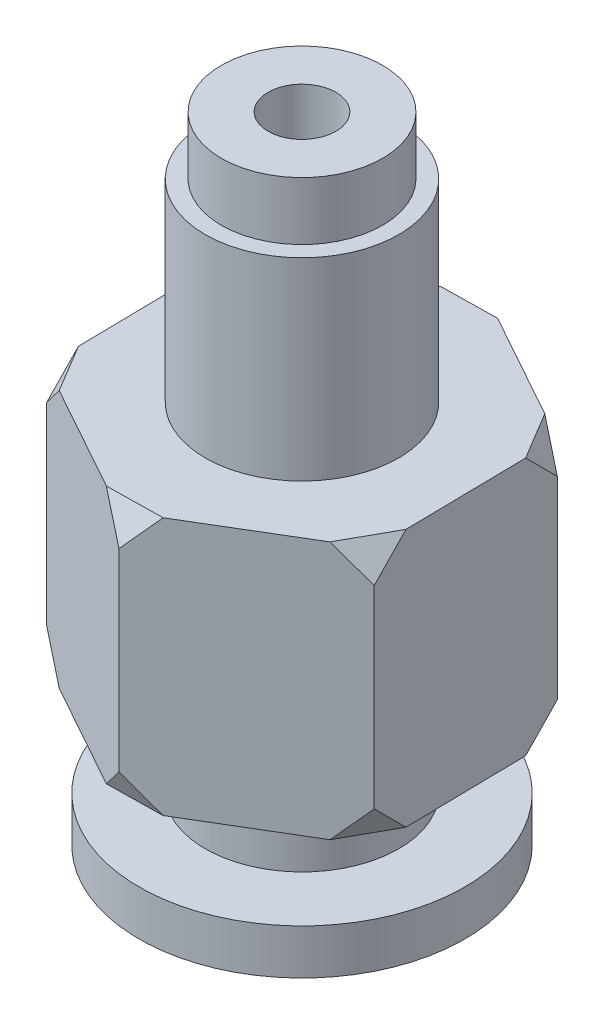
ISO-10303-21;
HEADER;
FILE_DESCRIPTION(('STEP AP214'),'2;1');
FILE_NAME('part.step','',(''),(''),'','','');
FILE_SCHEMA(('AUTOMOTIVE_DESIGN { 1 0 10303 214 1 1 1 1 }'));
ENDSEC;
DATA;
#1=APPLICATION_CONTEXT('core data for automotive mechanical design processes');
#2=APPLICATION_PROTOCOL_DEFINITION('international standard','automotive_design',2000,#1);
#3=PRODUCT_CONTEXT('',#1,'mechanical');
#4=PRODUCT('Part','Part','',(#3));
#5=PRODUCT_RELATED_PRODUCT_CATEGORY('part','',(#4));
#6=PRODUCT_DEFINITION_FORMATION('','',#4);
#7=PRODUCT_DEFINITION_CONTEXT('part definition',#1,'design');
#8=PRODUCT_DEFINITION('design','',#6,#7);
#9=PRODUCT_DEFINITION_SHAPE('','',#8);
#10=(LENGTH_UNIT() NAMED_UNIT(*) SI_UNIT(.MILLI.,.METRE.));
#11=(NAMED_UNIT(*) PLANE_ANGLE_UNIT() SI_UNIT($,.RADIAN.));
#12=(NAMED_UNIT(*) SI_UNIT($,.STERADIAN.) SOLID_ANGLE_UNIT());
#13=UNCERTAINTY_MEASURE_WITH_UNIT(LENGTH_MEASURE(1.E-05),#10,'distance_accuracy_value','');
#14=(GEOMETRIC_REPRESENTATION_CONTEXT(3) GLOBAL_UNCERTAINTY_ASSIGNED_CONTEXT((#13)) GLOBAL_UNIT_ASSIGNED_CONTEXT((#10,
#11,#12)) REPRESENTATION_CONTEXT('',''));
#15=CARTESIAN_POINT('',(0.,0.,0.));
#16=DIRECTION('',(0.,0.,1.));
#17=DIRECTION('',(1.,0.,0.));
#18=AXIS2_PLACEMENT_3D('',#15,#16,#17);
#19=CARTESIAN_POINT('',(0.,8.,0.));
#20=DIRECTION('',(0.,1.,0.));
#21=DIRECTION('',(0.,0.,1.));
#22=AXIS2_PLACEMENT_3D('',#19,#20,#21);
#23=PLANE('',#22);
#24=CARTESIAN_POINT('',(0.,8.,0.));
#25=DIRECTION('',(0.,1.,0.));
#26=DIRECTION('',(0.,0.,1.));
#27=AXIS2_PLACEMENT_3D('',#24,#25,#26);
#28=CIRCLE('',#27,3.);
#29=CARTESIAN_POINT('',(0.,8.,3.));
#30=VERTEX_POINT('',#29);
#31=EDGE_CURVE('E311',#30,#30,#28,.T.);
#32=ORIENTED_EDGE('',*,*,#31,.F.);
#33=EDGE_LOOP('',(#32));
#34=FACE_BOUND('',#33,.T.);
#35=DIRECTION('',(0.874029367472447,0.,0.485873095361036));
#36=VECTOR('',#35,1.);
#37=CARTESIAN_POINT('',(-4.95247092975446,8.,2.96755202536878));
#38=LINE('',#37,#36);
#39=CARTESIAN_POINT('',(-4.07844156228201,8.,3.45342512072982));
#40=VERTEX_POINT('',#39);
#41=CARTESIAN_POINT('',(-0.780289391328353,8.,5.28686855399465));
#42=VERTEX_POINT('',#41);
#43=EDGE_CURVE('E172',#40,#42,#38,.T.);
#44=ORIENTED_EDGE('',*,*,#43,.T.);
#45=DIRECTION('',(0.999868183565301,0.,-0.0162362401381879));
#46=VECTOR('',#45,1.);
#47=CARTESIAN_POINT('',(0.085621856075008,8.,5.27280755757304));
#48=LINE('',#47,#46);
#49=CARTESIAN_POINT('',(0.951533103478362,8.,5.25874656115142));
#50=VERTEX_POINT('',#49);
#51=EDGE_CURVE('E175',#42,#50,#48,.T.);
#52=ORIENTED_EDGE('',*,*,#51,.T.);
#53=DIRECTION('',(0.85779312733426,0.,-0.513995088204266));
#54=VECTOR('',#53,1.);
#55=CARTESIAN_POINT('',(0.0937399761440992,8.,5.77274164935569));
#56=LINE('',#55,#54);
#57=CARTESIAN_POINT('',(4.18841777856429,8.,3.31918471219117));
#58=VERTEX_POINT('',#57);
#59=EDGE_CURVE('E161',#50,#58,#56,.T.);
#60=ORIENTED_EDGE('',*,*,#59,.T.);
#61=DIRECTION('',(0.485873095361036,0.,-0.874029367472447));
#62=VECTOR('',#61,1.);
#63=CARTESIAN_POINT('',(4.60919622216233,8.,2.56225307630639));
#64=LINE('',#63,#62);
#65=CARTESIAN_POINT('',(5.02997466576037,8.,1.8053214404216));
#66=VERTEX_POINT('',#65);
#67=EDGE_CURVE('E189',#58,#66,#64,.T.);
#68=ORIENTED_EDGE('',*,*,#67,.T.);
#69=DIRECTION('',(-0.0162362401381876,0.,-0.999868183565301));
#70=VECTOR('',#69,1.);
#71=CARTESIAN_POINT('',(5.04621090589856,8.,2.80518962398691));
#72=LINE('',#71,#70);
#73=CARTESIAN_POINT('',(4.96870716989264,8.,-1.96768384180347));
#74=VERTEX_POINT('',#73);
#75=EDGE_CURVE('E329',#66,#74,#72,.T.);
#76=ORIENTED_EDGE('',*,*,#75,.T.);
#77=DIRECTION('',(0.513995088204266,0.,0.857793127334259));
#78=VECTOR('',#77,1.);
#79=CARTESIAN_POINT('',(4.52357436608732,8.,-2.71055448126665));
#80=LINE('',#79,#78);
#81=CARTESIAN_POINT('',(4.078441562282,8.,-3.45342512072982));
#82=VERTEX_POINT('',#81);
#83=EDGE_CURVE('E269',#82,#74,#80,.T.);
#84=ORIENTED_EDGE('',*,*,#83,.F.);
#85=DIRECTION('',(-0.874029367472447,0.,-0.485873095361036));
#86=VECTOR('',#85,1.);
#87=CARTESIAN_POINT('',(4.95247092975446,8.,-2.96755202536878));
#88=LINE('',#87,#86);
#89=CARTESIAN_POINT('',(0.78028939132835,8.,-5.28686855399465));
#90=VERTEX_POINT('',#89);
#91=EDGE_CURVE('E357',#82,#90,#88,.T.);
#92=ORIENTED_EDGE('',*,*,#91,.T.);
#93=DIRECTION('',(-0.999868183565301,0.,0.0162362401381879));
#94=VECTOR('',#93,1.);
#95=CARTESIAN_POINT('',(-0.085621856075008,8.,-5.27280755757304));
#96=LINE('',#95,#94);
#97=CARTESIAN_POINT('',(-0.951533103478365,8.,-5.25874656115142));
#98=VERTEX_POINT('',#97);
#99=EDGE_CURVE('E273',#90,#98,#96,.T.);
#100=ORIENTED_EDGE('',*,*,#99,.T.);
#101=DIRECTION('',(-0.85779312733426,0.,0.513995088204266));
#102=VECTOR('',#101,1.);
#103=CARTESIAN_POINT('',(-0.0937399761441001,8.,-5.77274164935569));
#104=LINE('',#103,#102);
#105=CARTESIAN_POINT('',(-4.18841777856429,8.,-3.31918471219118));
#106=VERTEX_POINT('',#105);
#107=EDGE_CURVE('E353',#98,#106,#104,.T.);
#108=ORIENTED_EDGE('',*,*,#107,.T.);
#109=DIRECTION('',(-0.485873095361036,0.,0.874029367472447));
#110=VECTOR('',#109,1.);
#111=CARTESIAN_POINT('',(-4.60919622216233,8.,-2.56225307630639));
#112=LINE('',#111,#110);
#113=CARTESIAN_POINT('',(-5.02997466576037,8.,-1.8053214404216));
#114=VERTEX_POINT('',#113);
#115=EDGE_CURVE('E200',#106,#114,#112,.T.);
#116=ORIENTED_EDGE('',*,*,#115,.T.);
#117=DIRECTION('',(0.0162362401381878,0.,0.999868183565301));
#118=VECTOR('',#117,1.);
#119=CARTESIAN_POINT('',(-5.04621090589856,8.,-2.80518962398691));
#120=LINE('',#119,#118);
#121=CARTESIAN_POINT('',(-4.96870716989265,8.,1.96768384180348));
#122=VERTEX_POINT('',#121);
#123=EDGE_CURVE('E350',#114,#122,#120,.T.);
#124=ORIENTED_EDGE('',*,*,#123,.T.);
#125=DIRECTION('',(0.513995088204266,0.,0.857793127334259));
#126=VECTOR('',#125,1.);
#127=CARTESIAN_POINT('',(-4.52357436608733,8.,2.71055448126665));
#128=LINE('',#127,#126);
#129=EDGE_CURVE('E204',#122,#40,#128,.T.);
#130=ORIENTED_EDGE('',*,*,#129,.T.);
#131=EDGE_LOOP('',(#44,#52,#60,#68,#76,#84,#92,#100,#108,#116,#124,#130));
#132=FACE_BOUND('',#131,.T.);
#133=ADVANCED_FACE('F39',(#34,#132),#23,.T.);
#134=CARTESIAN_POINT('',(-0.0937399761441001,8.,-5.77274164935569));
#135=DIRECTION('',(0.513995088204266,0.,0.85779312733426));
#136=DIRECTION('',(0.85779312733426,0.,-0.513995088204266));
#137=AXIS2_PLACEMENT_3D('',#134,#135,#136);
#138=PLANE('',#137);
#139=DIRECTION('',(-0.606551337193271,-0.707106781186547,0.363449412365814));
#140=VECTOR('',#139,1.);
#141=CARTESIAN_POINT('',(-2.1410788773542,10.3867513459481,-4.54596318077343));
#142=LINE('',#141,#140);
#143=CARTESIAN_POINT('',(-5.04621090589856,7.,-2.80518962398691));
#144=VERTEX_POINT('',#143);
#145=EDGE_CURVE('E196',#106,#144,#142,.T.);
#146=ORIENTED_EDGE('',*,*,#145,.F.);
#147=ORIENTED_EDGE('',*,*,#107,.F.);
#148=DIRECTION('',(-0.606551337193271,0.707106781186547,0.363449412365814));
#149=VECTOR('',#148,1.);
#150=CARTESIAN_POINT('',(-0.522636539811232,7.5,-5.51574410525355));
#151=LINE('',#150,#149);
#152=CARTESIAN_POINT('',(-0.0937399761441002,7.,-5.77274164935569));
#153=VERTEX_POINT('',#152);
#154=EDGE_CURVE('E280',#153,#98,#151,.T.);
#155=ORIENTED_EDGE('',*,*,#154,.F.);
#156=DIRECTION('',(0.,-1.,0.));
#157=VECTOR('',#156,1.);
#158=CARTESIAN_POINT('',(-0.0937399761441001,8.,-5.77274164935569));
#159=LINE('',#158,#157);
#160=CARTESIAN_POINT('',(-0.0937399761441002,1.,-5.77274164935569));
#161=VERTEX_POINT('',#160);
#162=EDGE_CURVE('E312',#153,#161,#159,.T.);
#163=ORIENTED_EDGE('',*,*,#162,.T.);
#164=DIRECTION('',(-0.606551337193271,-0.707106781186547,0.363449412365814));
#165=VECTOR('',#164,1.);
#166=CARTESIAN_POINT('',(2.90853596952581,4.5,-7.57172445807062));
#167=LINE('',#166,#165);
#168=CARTESIAN_POINT('',(-0.951533103478363,0.,-5.25874656115142));
#169=VERTEX_POINT('',#168);
#170=EDGE_CURVE('E287',#161,#169,#167,.T.);
#171=ORIENTED_EDGE('',*,*,#170,.T.);
#172=DIRECTION('',(-0.85779312733426,0.,0.513995088204266));
#173=VECTOR('',#172,1.);
#174=CARTESIAN_POINT('',(-0.0937399761441001,0.,-5.77274164935569));
#175=LINE('',#174,#173);
#176=CARTESIAN_POINT('',(-4.1884177785643,0.,-3.31918471219117));
#177=VERTEX_POINT('',#176);
#178=EDGE_CURVE('E336',#169,#177,#175,.T.);
#179=ORIENTED_EDGE('',*,*,#178,.T.);
#180=DIRECTION('',(-0.606551337193271,0.707106781186547,0.363449412365814));
#181=VECTOR('',#180,1.);
#182=CARTESIAN_POINT('',(-5.57225138669124,1.61324865405187,-2.48998282795637));
#183=LINE('',#182,#181);
#184=CARTESIAN_POINT('',(-5.04621090589856,1.,-2.80518962398691));
#185=VERTEX_POINT('',#184);
#186=EDGE_CURVE('E213',#177,#185,#183,.T.);
#187=ORIENTED_EDGE('',*,*,#186,.T.);
#188=DIRECTION('',(0.,-1.,0.));
#189=VECTOR('',#188,1.);
#190=CARTESIAN_POINT('',(-5.04621090589856,8.,-2.80518962398691));
#191=LINE('',#190,#189);
#192=EDGE_CURVE('E315',#144,#185,#191,.T.);
#193=ORIENTED_EDGE('',*,*,#192,.F.);
#194=EDGE_LOOP('',(#146,#147,#155,#163,#171,#179,#187,#193));
#195=FACE_BOUND('',#194,.T.);
#196=ADVANCED_FACE('F450',(#195),#138,.F.);
#197=CARTESIAN_POINT('',(0.,0.,0.));
#198=DIRECTION('',(0.,1.,0.));
#199=DIRECTION('',(0.,0.,1.));
#200=AXIS2_PLACEMENT_3D('',#197,#198,#199);
#201=PLANE('',#200);
#202=CARTESIAN_POINT('',(0.,0.,0.));
#203=DIRECTION('',(0.,-1.,0.));
#204=DIRECTION('',(0.,0.,-1.));
#205=AXIS2_PLACEMENT_3D('',#202,#203,#204);
#206=CIRCLE('',#205,3.);
#207=CARTESIAN_POINT('',(0.,0.,-3.));
#208=VERTEX_POINT('',#207);
#209=EDGE_CURVE('E307',#208,#208,#206,.T.);
#210=ORIENTED_EDGE('',*,*,#209,.F.);
#211=EDGE_LOOP('',(#210));
#212=FACE_BOUND('',#211,.T.);
#213=DIRECTION('',(0.0162362401381878,0.,0.999868183565301));
#214=VECTOR('',#213,1.);
#215=CARTESIAN_POINT('',(-5.04621090589856,0.,-2.80518962398691));
#216=LINE('',#215,#214);
#217=CARTESIAN_POINT('',(-5.02997466576037,0.,-1.80532144042161));
#218=VERTEX_POINT('',#217);
#219=CARTESIAN_POINT('',(-4.96870716989264,0.,1.96768384180348));
#220=VERTEX_POINT('',#219);
#221=EDGE_CURVE('E333',#218,#220,#216,.T.);
#222=ORIENTED_EDGE('',*,*,#221,.F.);
#223=DIRECTION('',(0.485873095361036,0.,-0.874029367472447));
#224=VECTOR('',#223,1.);
#225=CARTESIAN_POINT('',(-4.60919622216233,0.,-2.56225307630639));
#226=LINE('',#225,#224);
#227=EDGE_CURVE('E217',#218,#177,#226,.T.);
#228=ORIENTED_EDGE('',*,*,#227,.T.);
#229=ORIENTED_EDGE('',*,*,#178,.F.);
#230=DIRECTION('',(0.999868183565301,0.,-0.0162362401381879));
#231=VECTOR('',#230,1.);
#232=CARTESIAN_POINT('',(-0.0856218560750078,0.,-5.27280755757304));
#233=LINE('',#232,#231);
#234=CARTESIAN_POINT('',(0.780289391328346,0.,-5.28686855399465));
#235=VERTEX_POINT('',#234);
#236=EDGE_CURVE('E283',#169,#235,#233,.T.);
#237=ORIENTED_EDGE('',*,*,#236,.T.);
#238=DIRECTION('',(-0.874029367472447,0.,-0.485873095361036));
#239=VECTOR('',#238,1.);
#240=CARTESIAN_POINT('',(4.95247092975446,0.,-2.96755202536878));
#241=LINE('',#240,#239);
#242=CARTESIAN_POINT('',(4.07844156228201,0.,-3.45342512072982));
#243=VERTEX_POINT('',#242);
#244=EDGE_CURVE('E340',#243,#235,#241,.T.);
#245=ORIENTED_EDGE('',*,*,#244,.F.);
#246=DIRECTION('',(-0.513995088204266,0.,-0.857793127334259));
#247=VECTOR('',#246,1.);
#248=CARTESIAN_POINT('',(4.52357436608733,0.,-2.71055448126665));
#249=LINE('',#248,#247);
#250=CARTESIAN_POINT('',(4.96870716989264,0.,-1.96768384180348));
#251=VERTEX_POINT('',#250);
#252=EDGE_CURVE('E295',#251,#243,#249,.T.);
#253=ORIENTED_EDGE('',*,*,#252,.F.);
#254=DIRECTION('',(-0.0162362401381876,0.,-0.999868183565301));
#255=VECTOR('',#254,1.);
#256=CARTESIAN_POINT('',(5.04621090589856,0.,2.80518962398691));
#257=LINE('',#256,#255);
#258=CARTESIAN_POINT('',(5.02997466576037,0.,1.80532144042161));
#259=VERTEX_POINT('',#258);
#260=EDGE_CURVE('E344',#259,#251,#257,.T.);
#261=ORIENTED_EDGE('',*,*,#260,.F.);
#262=DIRECTION('',(-0.485873095361036,0.,0.874029367472447));
#263=VECTOR('',#262,1.);
#264=CARTESIAN_POINT('',(4.60919622216233,0.,2.56225307630639));
#265=LINE('',#264,#263);
#266=CARTESIAN_POINT('',(4.1884177785643,0.,3.31918471219117));
#267=VERTEX_POINT('',#266);
#268=EDGE_CURVE('E253',#259,#267,#265,.T.);
#269=ORIENTED_EDGE('',*,*,#268,.T.);
#270=DIRECTION('',(0.85779312733426,0.,-0.513995088204266));
#271=VECTOR('',#270,1.);
#272=CARTESIAN_POINT('',(0.0937399761440992,0.,5.77274164935569));
#273=LINE('',#272,#271);
#274=CARTESIAN_POINT('',(0.951533103478362,0.,5.25874656115142));
#275=VERTEX_POINT('',#274);
#276=EDGE_CURVE('E326',#275,#267,#273,.T.);
#277=ORIENTED_EDGE('',*,*,#276,.F.);
#278=DIRECTION('',(-0.999868183565301,0.,0.0162362401381879));
#279=VECTOR('',#278,1.);
#280=CARTESIAN_POINT('',(0.0856218560750078,0.,5.27280755757304));
#281=LINE('',#280,#279);
#282=CARTESIAN_POINT('',(-0.780289391328349,0.,5.28686855399465));
#283=VERTEX_POINT('',#282);
#284=EDGE_CURVE('E241',#275,#283,#281,.T.);
#285=ORIENTED_EDGE('',*,*,#284,.T.);
#286=DIRECTION('',(0.874029367472447,0.,0.485873095361036));
#287=VECTOR('',#286,1.);
#288=CARTESIAN_POINT('',(-4.95247092975446,0.,2.96755202536878));
#289=LINE('',#288,#287);
#290=CARTESIAN_POINT('',(-4.07844156228201,0.,3.45342512072982));
#291=VERTEX_POINT('',#290);
#292=EDGE_CURVE('E330',#291,#283,#289,.T.);
#293=ORIENTED_EDGE('',*,*,#292,.F.);
#294=DIRECTION('',(-0.513995088204266,0.,-0.857793127334259));
#295=VECTOR('',#294,1.);
#296=CARTESIAN_POINT('',(-4.52357436608733,0.,2.71055448126665));
#297=LINE('',#296,#295);
#298=EDGE_CURVE('E229',#291,#220,#297,.T.);
#299=ORIENTED_EDGE('',*,*,#298,.T.);
#300=EDGE_LOOP('',(#222,#228,#229,#237,#245,#253,#261,#269,#277,#285,#293,#299));
#301=FACE_BOUND('',#300,.T.);
#302=ADVANCED_FACE('F458',(#212,#301),#201,.F.);
#303=CARTESIAN_POINT('',(-5.04621090589856,8.,-2.80518962398691));
#304=DIRECTION('',(0.999868183565301,0.,-0.0162362401381878));
#305=DIRECTION('',(-0.0162362401381878,0.,-0.999868183565301));
#306=AXIS2_PLACEMENT_3D('',#303,#304,#305);
#307=PLANE('',#306);
#308=DIRECTION('',(0.0114807555026857,0.707106781186547,0.707013572891701));
#309=VECTOR('',#308,1.);
#310=CARTESIAN_POINT('',(-5.03809278582946,7.5,-2.30525553220426));
#311=LINE('',#310,#309);
#312=EDGE_CURVE('E192',#144,#114,#311,.T.);
#313=ORIENTED_EDGE('',*,*,#312,.F.);
#314=ORIENTED_EDGE('',*,*,#192,.T.);
#315=DIRECTION('',(0.0114807555026857,-0.707106781186547,0.707013572891701));
#316=VECTOR('',#315,1.);
#317=CARTESIAN_POINT('',(-5.10303774638221,4.5,-6.30472826646546));
#318=LINE('',#317,#316);
#319=EDGE_CURVE('E221',#185,#218,#318,.T.);
#320=ORIENTED_EDGE('',*,*,#319,.T.);
#321=ORIENTED_EDGE('',*,*,#221,.T.);
#322=DIRECTION('',(0.0114807555026858,0.707106781186548,0.7070135728917));
#323=VECTOR('',#322,1.);
#324=CARTESIAN_POINT('',(-4.94251407734285,1.61324865405187,3.5807198431695));
#325=LINE('',#324,#323);
#326=CARTESIAN_POINT('',(-4.95247092975446,0.999999999999998,2.96755202536878));
#327=VERTEX_POINT('',#326);
#328=EDGE_CURVE('E225',#220,#327,#325,.T.);
#329=ORIENTED_EDGE('',*,*,#328,.T.);
#330=DIRECTION('',(0.,-1.,0.));
#331=VECTOR('',#330,1.);
#332=CARTESIAN_POINT('',(-4.95247092975446,8.,2.96755202536878));
#333=LINE('',#332,#331);
#334=CARTESIAN_POINT('',(-4.95247092975446,7.,2.96755202536878));
#335=VERTEX_POINT('',#334);
#336=EDGE_CURVE('E318',#335,#327,#333,.T.);
#337=ORIENTED_EDGE('',*,*,#336,.F.);
#338=DIRECTION('',(0.0114807555026858,-0.707106781186548,0.7070135728917));
#339=VECTOR('',#338,1.);
#340=CARTESIAN_POINT('',(-5.0074590378956,10.3867513459481,-0.41875289109171));
#341=LINE('',#340,#339);
#342=EDGE_CURVE('E210',#122,#335,#341,.T.);
#343=ORIENTED_EDGE('',*,*,#342,.F.);
#344=ORIENTED_EDGE('',*,*,#123,.F.);
#345=EDGE_LOOP('',(#313,#314,#320,#321,#329,#337,#343,#344));
#346=FACE_BOUND('',#345,.T.);
#347=ADVANCED_FACE('F468',(#346),#307,.F.);
#348=CARTESIAN_POINT('',(-4.95247092975446,8.,2.96755202536878));
#349=DIRECTION('',(0.485873095361036,0.,-0.874029367472447));
#350=DIRECTION('',(-0.874029367472447,0.,-0.485873095361036));
#351=AXIS2_PLACEMENT_3D('',#348,#349,#350);
#352=PLANE('',#351);
#353=DIRECTION('',(0.618032092695956,-0.707106781186548,0.343564160525886));
#354=VECTOR('',#353,1.);
#355=CARTESIAN_POINT('',(-2.8663801605414,10.3867513459481,4.12721028968172));
#356=LINE('',#355,#354);
#357=CARTESIAN_POINT('',(0.0937399761440992,7.,5.77274164935569));
#358=VERTEX_POINT('',#357);
#359=EDGE_CURVE('E48',#42,#358,#356,.T.);
#360=ORIENTED_EDGE('',*,*,#359,.F.);
#361=ORIENTED_EDGE('',*,*,#43,.F.);
#362=DIRECTION('',(0.618032092695956,0.707106781186547,0.343564160525887));
#363=VECTOR('',#362,1.);
#364=CARTESIAN_POINT('',(-4.51545624601823,7.5,3.2104885730493));
#365=LINE('',#364,#363);
#366=EDGE_CURVE('E207',#335,#40,#365,.T.);
#367=ORIENTED_EDGE('',*,*,#366,.F.);
#368=ORIENTED_EDGE('',*,*,#336,.T.);
#369=DIRECTION('',(0.618032092695956,-0.707106781186548,0.343564160525886));
#370=VECTOR('',#369,1.);
#371=CARTESIAN_POINT('',(-8.01157371590802,4.5,1.26699619160516));
#372=LINE('',#371,#370);
#373=EDGE_CURVE('E233',#327,#291,#372,.T.);
#374=ORIENTED_EDGE('',*,*,#373,.T.);
#375=ORIENTED_EDGE('',*,*,#292,.T.);
#376=DIRECTION('',(0.618032092695956,0.707106781186548,0.343564160525886));
#377=VECTOR('',#376,1.);
#378=CARTESIAN_POINT('',(0.629737309348388,1.61324865405188,6.07070267112586));
#379=LINE('',#378,#377);
#380=CARTESIAN_POINT('',(0.0937399761440988,1.,5.77274164935569));
#381=VERTEX_POINT('',#380);
#382=EDGE_CURVE('E237',#283,#381,#379,.T.);
#383=ORIENTED_EDGE('',*,*,#382,.T.);
#384=DIRECTION('',(0.,-1.,0.));
#385=VECTOR('',#384,1.);
#386=CARTESIAN_POINT('',(0.0937399761440992,8.,5.77274164935569));
#387=LINE('',#386,#385);
#388=EDGE_CURVE('E321',#358,#381,#387,.T.);
#389=ORIENTED_EDGE('',*,*,#388,.F.);
#390=EDGE_LOOP('',(#360,#361,#367,#368,#374,#375,#383,#389));
#391=FACE_BOUND('',#390,.T.);
#392=ADVANCED_FACE('F472',(#391),#352,.F.);
#393=CARTESIAN_POINT('',(0.0937399761440992,8.,5.77274164935569));
#394=DIRECTION('',(-0.513995088204266,0.,-0.85779312733426));
#395=DIRECTION('',(-0.85779312733426,0.,0.513995088204266));
#396=AXIS2_PLACEMENT_3D('',#393,#394,#395);
#397=PLANE('',#396);
#398=DIRECTION('',(0.606551337193271,0.707106781186547,-0.363449412365814));
#399=VECTOR('',#398,1.);
#400=CARTESIAN_POINT('',(0.522636539811231,7.5,5.51574410525355));
#401=LINE('',#400,#399);
#402=EDGE_CURVE('E11',#358,#50,#401,.T.);
#403=ORIENTED_EDGE('',*,*,#402,.F.);
#404=ORIENTED_EDGE('',*,*,#388,.T.);
#405=DIRECTION('',(0.606551337193271,-0.707106781186548,-0.363449412365814));
#406=VECTOR('',#405,1.);
#407=CARTESIAN_POINT('',(-2.90853596952581,4.5,7.57172445807062));
#408=LINE('',#407,#406);
#409=EDGE_CURVE('E245',#381,#275,#408,.T.);
#410=ORIENTED_EDGE('',*,*,#409,.T.);
#411=ORIENTED_EDGE('',*,*,#276,.T.);
#412=DIRECTION('',(0.606551337193271,0.707106781186547,-0.363449412365814));
#413=VECTOR('',#412,1.);
#414=CARTESIAN_POINT('',(5.57225138669123,1.61324865405187,2.48998282795637));
#415=LINE('',#414,#413);
#416=CARTESIAN_POINT('',(5.04621090589856,0.999999999999997,2.80518962398691));
#417=VERTEX_POINT('',#416);
#418=EDGE_CURVE('E249',#267,#417,#415,.T.);
#419=ORIENTED_EDGE('',*,*,#418,.T.);
#420=DIRECTION('',(0.,-1.,0.));
#421=VECTOR('',#420,1.);
#422=CARTESIAN_POINT('',(5.04621090589856,8.,2.80518962398691));
#423=LINE('',#422,#421);
#424=CARTESIAN_POINT('',(5.04621090589856,7.,2.80518962398691));
#425=VERTEX_POINT('',#424);
#426=EDGE_CURVE('E171',#425,#417,#423,.T.);
#427=ORIENTED_EDGE('',*,*,#426,.F.);
#428=DIRECTION('',(0.606551337193271,-0.707106781186547,-0.363449412365814));
#429=VECTOR('',#428,1.);
#430=CARTESIAN_POINT('',(2.14107887735419,10.3867513459481,4.54596318077343));
#431=LINE('',#430,#429);
#432=EDGE_CURVE('E166',#58,#425,#431,.T.);
#433=ORIENTED_EDGE('',*,*,#432,.F.);
#434=ORIENTED_EDGE('',*,*,#59,.F.);
#435=EDGE_LOOP('',(#403,#404,#410,#411,#419,#427,#433,#434));
#436=FACE_BOUND('',#435,.T.);
#437=ADVANCED_FACE('F163',(#436),#397,.F.);
#438=CARTESIAN_POINT('',(5.04621090589856,8.,2.80518962398691));
#439=DIRECTION('',(-0.999868183565301,0.,0.0162362401381876));
#440=DIRECTION('',(0.0162362401381876,0.,0.999868183565301));
#441=AXIS2_PLACEMENT_3D('',#438,#439,#440);
#442=PLANE('',#441);
#443=DIRECTION('',(-0.0114807555026856,0.707106781186547,-0.707013572891701));
#444=VECTOR('',#443,1.);
#445=CARTESIAN_POINT('',(5.03809278582946,7.5,2.30525553220425));
#446=LINE('',#445,#444);
#447=EDGE_CURVE('E179',#425,#66,#446,.T.);
#448=ORIENTED_EDGE('',*,*,#447,.F.);
#449=ORIENTED_EDGE('',*,*,#426,.T.);
#450=DIRECTION('',(-0.0114807555026856,-0.707106781186547,-0.7070135728917));
#451=VECTOR('',#450,1.);
#452=CARTESIAN_POINT('',(5.10303774638221,4.5,6.30472826646546));
#453=LINE('',#452,#451);
#454=EDGE_CURVE('E257',#417,#259,#453,.T.);
#455=ORIENTED_EDGE('',*,*,#454,.T.);
#456=ORIENTED_EDGE('',*,*,#260,.T.);
#457=DIRECTION('',(0.0114807555026857,-0.707106781186547,0.7070135728917));
#458=VECTOR('',#457,1.);
#459=CARTESIAN_POINT('',(4.94251407734285,1.61324865405187,-3.58071984316949));
#460=LINE('',#459,#458);
#461=CARTESIAN_POINT('',(4.95247092975446,1.,-2.96755202536878));
#462=VERTEX_POINT('',#461);
#463=EDGE_CURVE('E303',#462,#251,#460,.T.);
#464=ORIENTED_EDGE('',*,*,#463,.F.);
#465=DIRECTION('',(0.,-1.,0.));
#466=VECTOR('',#465,1.);
#467=CARTESIAN_POINT('',(4.95247092975446,8.,-2.96755202536878));
#468=LINE('',#467,#466);
#469=CARTESIAN_POINT('',(4.95247092975446,7.,-2.96755202536878));
#470=VERTEX_POINT('',#469);
#471=EDGE_CURVE('E308',#470,#462,#468,.T.);
#472=ORIENTED_EDGE('',*,*,#471,.F.);
#473=DIRECTION('',(0.0114807555026857,0.707106781186547,0.707013572891701));
#474=VECTOR('',#473,1.);
#475=CARTESIAN_POINT('',(5.0074590378956,10.3867513459481,0.418752891091717));
#476=LINE('',#475,#474);
#477=EDGE_CURVE('E261',#470,#74,#476,.T.);
#478=ORIENTED_EDGE('',*,*,#477,.T.);
#479=ORIENTED_EDGE('',*,*,#75,.F.);
#480=EDGE_LOOP('',(#448,#449,#455,#456,#464,#472,#478,#479));
#481=FACE_BOUND('',#480,.T.);
#482=ADVANCED_FACE('F41',(#481),#442,.F.);
#483=CARTESIAN_POINT('',(4.95247092975446,8.,-2.96755202536878));
#484=DIRECTION('',(-0.485873095361036,0.,0.874029367472447));
#485=DIRECTION('',(0.874029367472447,0.,0.485873095361036));
#486=AXIS2_PLACEMENT_3D('',#483,#484,#485);
#487=PLANE('',#486);
#488=ORIENTED_EDGE('',*,*,#91,.F.);
#489=DIRECTION('',(0.618032092695956,-0.707106781186547,0.343564160525887));
#490=VECTOR('',#489,1.);
#491=CARTESIAN_POINT('',(4.51545624601823,7.5,-3.2104885730493));
#492=LINE('',#491,#490);
#493=EDGE_CURVE('E265',#82,#470,#492,.T.);
#494=ORIENTED_EDGE('',*,*,#493,.T.);
#495=ORIENTED_EDGE('',*,*,#471,.T.);
#496=DIRECTION('',(0.618032092695956,0.707106781186548,0.343564160525887));
#497=VECTOR('',#496,1.);
#498=CARTESIAN_POINT('',(8.01157371590802,4.5,-1.26699619160516));
#499=LINE('',#498,#497);
#500=EDGE_CURVE('E299',#243,#462,#499,.T.);
#501=ORIENTED_EDGE('',*,*,#500,.F.);
#502=ORIENTED_EDGE('',*,*,#244,.T.);
#503=DIRECTION('',(-0.618032092695956,0.707106781186548,-0.343564160525886));
#504=VECTOR('',#503,1.);
#505=CARTESIAN_POINT('',(-0.629737309348391,1.61324865405188,-6.07070267112586));
#506=LINE('',#505,#504);
#507=EDGE_CURVE('E291',#235,#161,#506,.T.);
#508=ORIENTED_EDGE('',*,*,#507,.T.);
#509=ORIENTED_EDGE('',*,*,#162,.F.);
#510=DIRECTION('',(-0.618032092695956,-0.707106781186548,-0.343564160525886));
#511=VECTOR('',#510,1.);
#512=CARTESIAN_POINT('',(2.8663801605414,10.3867513459481,-4.12721028968172));
#513=LINE('',#512,#511);
#514=EDGE_CURVE('E277',#90,#153,#513,.T.);
#515=ORIENTED_EDGE('',*,*,#514,.F.);
#516=EDGE_LOOP('',(#488,#494,#495,#501,#502,#508,#509,#515));
#517=FACE_BOUND('',#516,.T.);
#518=ADVANCED_FACE('F476',(#517),#487,.F.);
#519=CARTESIAN_POINT('',(0.,14.,0.));
#520=DIRECTION('',(0.,-1.,0.));
#521=DIRECTION('',(0.,0.,-1.));
#522=AXIS2_PLACEMENT_3D('',#519,#520,#521);
#523=CYLINDRICAL_SURFACE('',#522,3.);
#524=CARTESIAN_POINT('',(0.,14.,0.));
#525=DIRECTION('',(0.,1.,0.));
#526=DIRECTION('',(0.,0.,1.));
#527=AXIS2_PLACEMENT_3D('',#524,#525,#526);
#528=CIRCLE('',#527,3.);
#529=CARTESIAN_POINT('',(0.,14.,3.));
#530=VERTEX_POINT('',#529);
#531=EDGE_CURVE('E346',#530,#530,#528,.T.);
#532=ORIENTED_EDGE('',*,*,#531,.F.);
#533=EDGE_LOOP('',(#532));
#534=FACE_BOUND('',#533,.T.);
#535=ORIENTED_EDGE('',*,*,#31,.T.);
#536=EDGE_LOOP('',(#535));
#537=FACE_BOUND('',#536,.T.);
#538=ADVANCED_FACE('F464',(#534,#537),#523,.T.);
#539=CARTESIAN_POINT('',(0.,14.,0.));
#540=DIRECTION('',(0.,1.,0.));
#541=DIRECTION('',(0.,0.,1.));
#542=AXIS2_PLACEMENT_3D('',#539,#540,#541);
#543=PLANE('',#542);
#544=CARTESIAN_POINT('',(0.,14.,0.));
#545=DIRECTION('',(0.,1.,0.));
#546=DIRECTION('',(0.,0.,1.));
#547=AXIS2_PLACEMENT_3D('',#544,#545,#546);
#548=CIRCLE('',#547,2.5);
#549=CARTESIAN_POINT('',(0.,14.,2.5));
#550=VERTEX_POINT('',#549);
#551=EDGE_CURVE('E365',#550,#550,#548,.T.);
#552=ORIENTED_EDGE('',*,*,#551,.F.);
#553=EDGE_LOOP('',(#552));
#554=FACE_BOUND('',#553,.T.);
#555=ORIENTED_EDGE('',*,*,#531,.T.);
#556=EDGE_LOOP('',(#555));
#557=FACE_BOUND('',#556,.T.);
#558=ADVANCED_FACE('F484',(#554,#557),#543,.T.);
#559=CARTESIAN_POINT('',(0.,15.8,0.));
#560=DIRECTION('',(0.,-1.,0.));
#561=DIRECTION('',(0.,0.,-1.));
#562=AXIS2_PLACEMENT_3D('',#559,#560,#561);
#563=CYLINDRICAL_SURFACE('',#562,2.5);
#564=CARTESIAN_POINT('',(0.,15.8,0.));
#565=DIRECTION('',(0.,1.,0.));
#566=DIRECTION('',(0.,0.,1.));
#567=AXIS2_PLACEMENT_3D('',#564,#565,#566);
#568=CIRCLE('',#567,2.5);
#569=CARTESIAN_POINT('',(0.,15.8,2.5));
#570=VERTEX_POINT('',#569);
#571=EDGE_CURVE('E369',#570,#570,#568,.T.);
#572=ORIENTED_EDGE('',*,*,#571,.F.);
#573=EDGE_LOOP('',(#572));
#574=FACE_BOUND('',#573,.T.);
#575=ORIENTED_EDGE('',*,*,#551,.T.);
#576=EDGE_LOOP('',(#575));
#577=FACE_BOUND('',#576,.T.);
#578=ADVANCED_FACE('F719',(#574,#577),#563,.T.);
#579=CARTESIAN_POINT('',(0.,15.8,0.));
#580=DIRECTION('',(0.,1.,0.));
#581=DIRECTION('',(0.,0.,1.));
#582=AXIS2_PLACEMENT_3D('',#579,#580,#581);
#583=PLANE('',#582);
#584=CARTESIAN_POINT('',(0.,15.8,0.));
#585=DIRECTION('',(0.,-1.,0.));
#586=DIRECTION('',(0.,0.,-1.));
#587=AXIS2_PLACEMENT_3D('',#584,#585,#586);
#588=CIRCLE('',#587,1.05);
#589=CARTESIAN_POINT('',(0.,15.8,-1.05));
#590=VERTEX_POINT('',#589);
#591=EDGE_CURVE('E396',#590,#590,#588,.T.);
#592=ORIENTED_EDGE('',*,*,#591,.T.);
#593=EDGE_LOOP('',(#592));
#594=FACE_BOUND('',#593,.T.);
#595=ORIENTED_EDGE('',*,*,#571,.T.);
#596=EDGE_LOOP('',(#595));
#597=FACE_BOUND('',#596,.T.);
#598=ADVANCED_FACE('F408',(#594,#597),#583,.T.);
#599=CARTESIAN_POINT('',(0.,-2.5,0.));
#600=DIRECTION('',(0.,1.,0.));
#601=DIRECTION('',(0.,0.,1.));
#602=AXIS2_PLACEMENT_3D('',#599,#600,#601);
#603=CYLINDRICAL_SURFACE('',#602,3.);
#604=CARTESIAN_POINT('',(0.,-2.5,0.));
#605=DIRECTION('',(0.,-1.,0.));
#606=DIRECTION('',(0.,0.,-1.));
#607=AXIS2_PLACEMENT_3D('',#604,#605,#606);
#608=CIRCLE('',#607,3.);
#609=CARTESIAN_POINT('',(0.,-2.5,-3.));
#610=VERTEX_POINT('',#609);
#611=EDGE_CURVE('E376',#610,#610,#608,.T.);
#612=ORIENTED_EDGE('',*,*,#611,.F.);
#613=EDGE_LOOP('',(#612));
#614=FACE_BOUND('',#613,.T.);
#615=ORIENTED_EDGE('',*,*,#209,.T.);
#616=EDGE_LOOP('',(#615));
#617=FACE_BOUND('',#616,.T.);
#618=ADVANCED_FACE('F440',(#614,#617),#603,.T.);
#619=CARTESIAN_POINT('',(0.,-3.9,0.));
#620=DIRECTION('',(0.,1.,0.));
#621=DIRECTION('',(0.,0.,1.));
#622=AXIS2_PLACEMENT_3D('',#619,#620,#621);
#623=CYLINDRICAL_SURFACE('',#622,5.05);
#624=CARTESIAN_POINT('',(0.,-3.9,0.));
#625=DIRECTION('',(0.,-1.,0.));
#626=DIRECTION('',(0.,0.,-1.));
#627=AXIS2_PLACEMENT_3D('',#624,#625,#626);
#628=CIRCLE('',#627,5.05);
#629=CARTESIAN_POINT('',(0.,-3.9,-5.05));
#630=VERTEX_POINT('',#629);
#631=EDGE_CURVE('E383',#630,#630,#628,.T.);
#632=ORIENTED_EDGE('',*,*,#631,.F.);
#633=EDGE_LOOP('',(#632));
#634=FACE_BOUND('',#633,.T.);
#635=CARTESIAN_POINT('',(0.,-2.5,0.));
#636=DIRECTION('',(0.,-1.,0.));
#637=DIRECTION('',(0.,0.,-1.));
#638=AXIS2_PLACEMENT_3D('',#635,#636,#637);
#639=CIRCLE('',#638,5.05);
#640=CARTESIAN_POINT('',(0.,-2.5,-5.05));
#641=VERTEX_POINT('',#640);
#642=EDGE_CURVE('E384',#641,#641,#639,.T.);
#643=ORIENTED_EDGE('',*,*,#642,.T.);
#644=EDGE_LOOP('',(#643));
#645=FACE_BOUND('',#644,.T.);
#646=ADVANCED_FACE('F434',(#634,#645),#623,.T.);
#647=CARTESIAN_POINT('',(0.,-3.9,0.));
#648=DIRECTION('',(0.,-1.,0.));
#649=DIRECTION('',(0.,0.,-1.));
#650=AXIS2_PLACEMENT_3D('',#647,#648,#649);
#651=PLANE('',#650);
#652=CARTESIAN_POINT('',(0.,-3.9,0.));
#653=DIRECTION('',(0.,-1.,0.));
#654=DIRECTION('',(0.,0.,-1.));
#655=AXIS2_PLACEMENT_3D('',#652,#653,#654);
#656=CIRCLE('',#655,2.15);
#657=CARTESIAN_POINT('',(0.,-3.9,-2.15));
#658=VERTEX_POINT('',#657);
#659=EDGE_CURVE('E392',#658,#658,#656,.T.);
#660=ORIENTED_EDGE('',*,*,#659,.F.);
#661=EDGE_LOOP('',(#660));
#662=FACE_BOUND('',#661,.T.);
#663=ORIENTED_EDGE('',*,*,#631,.T.);
#664=EDGE_LOOP('',(#663));
#665=FACE_BOUND('',#664,.T.);
#666=ADVANCED_FACE('F431',(#662,#665),#651,.T.);
#667=CARTESIAN_POINT('',(0.,-2.5,0.));
#668=DIRECTION('',(0.,-1.,0.));
#669=DIRECTION('',(0.,0.,-1.));
#670=AXIS2_PLACEMENT_3D('',#667,#668,#669);
#671=PLANE('',#670);
#672=ORIENTED_EDGE('',*,*,#611,.T.);
#673=EDGE_LOOP('',(#672));
#674=FACE_BOUND('',#673,.T.);
#675=ORIENTED_EDGE('',*,*,#642,.F.);
#676=EDGE_LOOP('',(#675));
#677=FACE_BOUND('',#676,.T.);
#678=ADVANCED_FACE('F427',(#674,#677),#671,.F.);
#679=CARTESIAN_POINT('',(0.,10.6,0.));
#680=DIRECTION('',(0.,-1.,0.));
#681=DIRECTION('',(0.,0.,-1.));
#682=AXIS2_PLACEMENT_3D('',#679,#680,#681);
#683=CYLINDRICAL_SURFACE('',#682,2.15);
#684=CARTESIAN_POINT('',(0.,10.6,0.));
#685=DIRECTION('',(0.,-1.,0.));
#686=DIRECTION('',(0.,0.,-1.));
#687=AXIS2_PLACEMENT_3D('',#684,#685,#686);
#688=CIRCLE('',#687,2.15);
#689=CARTESIAN_POINT('',(0.,10.6,-2.15));
#690=VERTEX_POINT('',#689);
#691=EDGE_CURVE('E388',#690,#690,#688,.T.);
#692=CARTESIAN_POINT('',(0.,10.6,-2.15));
#693=CARTESIAN_POINT('',(0.,10.4489583333333,-2.15));
#694=CARTESIAN_POINT('',(0.,10.2979166666667,-2.15));
#695=CARTESIAN_POINT('',(0.,9.99583333333334,-2.15));
#696=CARTESIAN_POINT('',(0.,9.84479166666667,-2.15));
#697=CARTESIAN_POINT('',(0.,9.54270833333334,-2.15));
#698=CARTESIAN_POINT('',(0.,9.39166666666667,-2.15));
#699=CARTESIAN_POINT('',(0.,9.08958333333334,-2.15));
#700=CARTESIAN_POINT('',(0.,8.93854166666667,-2.15));
#701=CARTESIAN_POINT('',(0.,8.63645833333334,-2.15));
#702=CARTESIAN_POINT('',(0.,8.48541666666667,-2.15));
#703=CARTESIAN_POINT('',(0.,8.18333333333334,-2.15));
#704=CARTESIAN_POINT('',(0.,8.03229166666667,-2.15));
#705=CARTESIAN_POINT('',(0.,7.73020833333334,-2.15));
#706=CARTESIAN_POINT('',(0.,7.57916666666667,-2.15));
#707=CARTESIAN_POINT('',(0.,7.27708333333334,-2.15));
#708=CARTESIAN_POINT('',(0.,7.12604166666667,-2.15));
#709=CARTESIAN_POINT('',(0.,6.82395833333334,-2.15));
#710=CARTESIAN_POINT('',(0.,6.67291666666667,-2.15));
#711=CARTESIAN_POINT('',(0.,6.37083333333334,-2.15));
#712=CARTESIAN_POINT('',(0.,6.21979166666667,-2.15));
#713=CARTESIAN_POINT('',(0.,5.91770833333334,-2.15));
#714=CARTESIAN_POINT('',(0.,5.76666666666667,-2.15));
#715=CARTESIAN_POINT('',(0.,5.46458333333334,-2.15));
#716=CARTESIAN_POINT('',(0.,5.31354166666667,-2.15));
#717=CARTESIAN_POINT('',(0.,5.01145833333334,-2.15));
#718=CARTESIAN_POINT('',(0.,4.86041666666667,-2.15));
#719=CARTESIAN_POINT('',(0.,4.55833333333334,-2.15));
#720=CARTESIAN_POINT('',(0.,4.40729166666667,-2.15));
#721=CARTESIAN_POINT('',(0.,4.10520833333333,-2.15));
#722=CARTESIAN_POINT('',(0.,3.95416666666667,-2.15));
#723=CARTESIAN_POINT('',(0.,3.65208333333333,-2.15));
#724=CARTESIAN_POINT('',(0.,3.50104166666667,-2.15));
#725=CARTESIAN_POINT('',(0.,3.19895833333333,-2.15));
#726=CARTESIAN_POINT('',(0.,3.04791666666667,-2.15));
#727=CARTESIAN_POINT('',(0.,2.74583333333333,-2.15));
#728=CARTESIAN_POINT('',(0.,2.59479166666667,-2.15));
#729=CARTESIAN_POINT('',(0.,2.29270833333334,-2.15));
#730=CARTESIAN_POINT('',(0.,2.14166666666667,-2.15));
#731=CARTESIAN_POINT('',(0.,1.83958333333334,-2.15));
#732=CARTESIAN_POINT('',(0.,1.68854166666667,-2.15));
#733=CARTESIAN_POINT('',(0.,1.38645833333334,-2.15));
#734=CARTESIAN_POINT('',(0.,1.23541666666667,-2.15));
#735=CARTESIAN_POINT('',(0.,0.933333333333335,-2.15));
#736=CARTESIAN_POINT('',(0.,0.782291666666668,-2.15));
#737=CARTESIAN_POINT('',(0.,0.480208333333335,-2.15));
#738=CARTESIAN_POINT('',(0.,0.329166666666669,-2.15));
#739=CARTESIAN_POINT('',(0.,0.0270833333333362,-2.15));
#740=CARTESIAN_POINT('',(0.,-0.123958333333331,-2.15));
#741=CARTESIAN_POINT('',(0.,-0.426041666666664,-2.15));
#742=CARTESIAN_POINT('',(0.,-0.577083333333331,-2.15));
#743=CARTESIAN_POINT('',(0.,-0.879166666666665,-2.15));
#744=CARTESIAN_POINT('',(0.,-1.03020833333333,-2.15));
#745=CARTESIAN_POINT('',(0.,-1.33229166666667,-2.15));
#746=CARTESIAN_POINT('',(0.,-1.48333333333333,-2.15));
#747=CARTESIAN_POINT('',(0.,-1.78541666666667,-2.15));
#748=CARTESIAN_POINT('',(0.,-1.93645833333333,-2.15));
#749=CARTESIAN_POINT('',(0.,-2.23854166666667,-2.15));
#750=CARTESIAN_POINT('',(0.,-2.38958333333333,-2.15));
#751=CARTESIAN_POINT('',(0.,-2.69166666666666,-2.15));
#752=CARTESIAN_POINT('',(0.,-2.84270833333333,-2.15));
#753=CARTESIAN_POINT('',(0.,-3.14479166666667,-2.15));
#754=CARTESIAN_POINT('',(0.,-3.29583333333333,-2.15));
#755=CARTESIAN_POINT('',(0.,-3.59791666666667,-2.15));
#756=CARTESIAN_POINT('',(0.,-3.74895833333333,-2.15));
#757=CARTESIAN_POINT('',(0.,-3.9,-2.15));
#758=B_SPLINE_CURVE_WITH_KNOTS('',3,(#692,#693,#694,#695,#696,#697,#698,#699,#700,#701,#702,
#703,#704,#705,#706,#707,#708,#709,#710,#711,#712,#713,#714,#715,#716,#717,#718,#719,#720,#721,
#722,#723,#724,#725,#726,#727,#728,#729,#730,#731,#732,#733,#734,#735,#736,#737,#738,#739,#740,
#741,#742,#743,#744,#745,#746,#747,#748,#749,#750,#751,#752,#753,#754,#755,#756,#757),
.UNSPECIFIED.,.F.,.F.,(4,2,2,2,2,2,2,2,2,2,2,2,2,2,2,2,2,2,2,2,2,2,2,2,2,2,2,2,2,2,2,2,4),(0.,
0.453125,0.906250000000001,1.359375,1.8125,2.265625,2.71875,3.171875,3.625,4.078125,4.53125,
4.984375,5.4375,5.890625,6.34375,6.796875,7.25,7.703125,8.15625,8.609375,9.0625,9.515625,
9.96875,10.421875,10.875,11.328125,11.78125,12.234375,12.6875,13.140625,13.59375,14.046875,
14.5),.UNSPECIFIED.);
#759=EDGE_CURVE('BSEAM421',#690,#658,#758,.T.);
#760=ORIENTED_EDGE('',*,*,#691,.F.);
#761=ORIENTED_EDGE('',*,*,#659,.T.);
#762=ORIENTED_EDGE('',*,*,#759,.T.);
#763=ORIENTED_EDGE('',*,*,#759,.F.);
#764=EDGE_LOOP('',(#760,#762,#761,#763));
#765=FACE_BOUND('',#764,.T.);
#766=ADVANCED_FACE('F421',(#765),#683,.F.);
#767=CARTESIAN_POINT('',(0.,10.6,0.));
#768=DIRECTION('',(0.,-1.,0.));
#769=DIRECTION('',(0.,0.,-1.));
#770=AXIS2_PLACEMENT_3D('',#767,#768,#769);
#771=PLANE('',#770);
#772=CARTESIAN_POINT('',(0.,10.6,0.));
#773=DIRECTION('',(0.,-1.,0.));
#774=DIRECTION('',(0.,0.,-1.));
#775=AXIS2_PLACEMENT_3D('',#772,#773,#774);
#776=CIRCLE('',#775,1.05);
#777=CARTESIAN_POINT('',(0.,10.6,-1.05));
#778=VERTEX_POINT('',#777);
#779=EDGE_CURVE('E400',#778,#778,#776,.T.);
#780=ORIENTED_EDGE('',*,*,#779,.F.);
#781=EDGE_LOOP('',(#780));
#782=FACE_BOUND('',#781,.T.);
#783=ORIENTED_EDGE('',*,*,#691,.T.);
#784=EDGE_LOOP('',(#783));
#785=FACE_BOUND('',#784,.T.);
#786=ADVANCED_FACE('F415',(#782,#785),#771,.T.);
#787=CARTESIAN_POINT('',(0.,15.8,0.));
#788=DIRECTION('',(0.,-1.,0.));
#789=DIRECTION('',(0.,0.,-1.));
#790=AXIS2_PLACEMENT_3D('',#787,#788,#789);
#791=CYLINDRICAL_SURFACE('',#790,1.05);
#792=ORIENTED_EDGE('',*,*,#591,.F.);
#793=EDGE_LOOP('',(#792));
#794=FACE_BOUND('',#793,.T.);
#795=ORIENTED_EDGE('',*,*,#779,.T.);
#796=EDGE_LOOP('',(#795));
#797=FACE_BOUND('',#796,.T.);
#798=ADVANCED_FACE('F411',(#794,#797),#791,.F.);
#799=CARTESIAN_POINT('',(3.61885949286986,-2.1094010767585,-2.16844358501332));
#800=DIRECTION('',(0.767233497340615,-0.447213595499958,-0.459731182930295));
#801=DIRECTION('',(-0.513995088204266,0.,-0.857793127334259));
#802=AXIS2_PLACEMENT_3D('',#799,#800,#801);
#803=PLANE('',#802);
#804=ORIENTED_EDGE('',*,*,#500,.T.);
#805=ORIENTED_EDGE('',*,*,#463,.T.);
#806=ORIENTED_EDGE('',*,*,#252,.T.);
#807=EDGE_LOOP('',(#804,#805,#806));
#808=FACE_BOUND('',#807,.T.);
#809=ADVANCED_FACE('F414',(#808),#803,.T.);
#810=CARTESIAN_POINT('',(-0.0684974848600063,-2.1094010767585,-4.21824604605843));
#811=DIRECTION('',(0.0145221346591995,0.447213595499958,0.894309290796501));
#812=DIRECTION('',(0.,-0.894403607228857,0.447260759933183));
#813=AXIS2_PLACEMENT_3D('',#810,#811,#812);
#814=PLANE('',#813);
#815=ORIENTED_EDGE('',*,*,#507,.F.);
#816=ORIENTED_EDGE('',*,*,#236,.F.);
#817=ORIENTED_EDGE('',*,*,#170,.F.);
#818=EDGE_LOOP('',(#815,#816,#817));
#819=FACE_BOUND('',#818,.T.);
#820=ADVANCED_FACE('F501',(#819),#814,.F.);
#821=CARTESIAN_POINT('',(-0.120453453302208,3.7094010767585,-7.41782423346739));
#822=DIRECTION('',(-0.0145221346591995,0.447213595499958,-0.894309290796501));
#823=DIRECTION('',(0.,0.894403607228857,0.447260759933183));
#824=AXIS2_PLACEMENT_3D('',#821,#822,#823);
#825=PLANE('',#824);
#826=ORIENTED_EDGE('',*,*,#514,.T.);
#827=ORIENTED_EDGE('',*,*,#154,.T.);
#828=ORIENTED_EDGE('',*,*,#99,.F.);
#829=EDGE_LOOP('',(#826,#827,#828));
#830=FACE_BOUND('',#829,.T.);
#831=ADVANCED_FACE('F496',(#830),#825,.T.);
#832=CARTESIAN_POINT('',(6.36379750033949,3.7094010767585,-3.81322786726697));
#833=DIRECTION('',(-0.767233497340615,-0.447213595499958,0.459731182930295));
#834=DIRECTION('',(0.513995088204266,0.,0.857793127334259));
#835=AXIS2_PLACEMENT_3D('',#832,#833,#834);
#836=PLANE('',#835);
#837=ORIENTED_EDGE('',*,*,#493,.F.);
#838=ORIENTED_EDGE('',*,*,#83,.T.);
#839=ORIENTED_EDGE('',*,*,#477,.F.);
#840=EDGE_LOOP('',(#837,#838,#839));
#841=FACE_BOUND('',#840,.T.);
#842=ADVANCED_FACE('F548',(#841),#836,.F.);
#843=CARTESIAN_POINT('',(3.68735697772986,-2.1094010767585,2.04980246104511));
#844=DIRECTION('',(-0.781755631999814,0.447213595499958,-0.434578107866206));
#845=DIRECTION('',(-0.496554118670596,-0.868005764514999,0.));
#846=AXIS2_PLACEMENT_3D('',#843,#844,#845);
#847=PLANE('',#846);
#848=ORIENTED_EDGE('',*,*,#454,.F.);
#849=ORIENTED_EDGE('',*,*,#418,.F.);
#850=ORIENTED_EDGE('',*,*,#268,.F.);
#851=EDGE_LOOP('',(#848,#849,#850));
#852=FACE_BOUND('',#851,.T.);
#853=ADVANCED_FACE('F544',(#852),#847,.F.);
#854=CARTESIAN_POINT('',(0.0684974848600063,-2.1094010767585,4.21824604605843));
#855=DIRECTION('',(-0.0145221346591995,0.447213595499958,-0.894309290796501));
#856=DIRECTION('',(0.,0.894403607228857,0.447260759933183));
#857=AXIS2_PLACEMENT_3D('',#854,#855,#856);
#858=PLANE('',#857);
#859=ORIENTED_EDGE('',*,*,#409,.F.);
#860=ORIENTED_EDGE('',*,*,#382,.F.);
#861=ORIENTED_EDGE('',*,*,#284,.F.);
#862=EDGE_LOOP('',(#859,#860,#861));
#863=FACE_BOUND('',#862,.T.);
#864=ADVANCED_FACE('F541',(#863),#858,.F.);
#865=CARTESIAN_POINT('',(-3.61885949286986,-2.1094010767585,2.16844358501332));
#866=DIRECTION('',(0.767233497340615,0.447213595499958,-0.459731182930296));
#867=DIRECTION('',(-0.513995088204266,0.,-0.857793127334259));
#868=AXIS2_PLACEMENT_3D('',#865,#866,#867);
#869=PLANE('',#868);
#870=ORIENTED_EDGE('',*,*,#373,.F.);
#871=ORIENTED_EDGE('',*,*,#328,.F.);
#872=ORIENTED_EDGE('',*,*,#298,.F.);
#873=EDGE_LOOP('',(#870,#871,#872));
#874=FACE_BOUND('',#873,.T.);
#875=ADVANCED_FACE('F514',(#874),#869,.F.);
#876=CARTESIAN_POINT('',(-3.68735697772986,-2.1094010767585,-2.04980246104511));
#877=DIRECTION('',(0.781755631999814,0.447213595499958,0.434578107866205));
#878=DIRECTION('',(-0.496554118670597,0.868005764514999,0.));
#879=AXIS2_PLACEMENT_3D('',#876,#877,#878);
#880=PLANE('',#879);
#881=ORIENTED_EDGE('',*,*,#319,.F.);
#882=ORIENTED_EDGE('',*,*,#186,.F.);
#883=ORIENTED_EDGE('',*,*,#227,.F.);
#884=EDGE_LOOP('',(#881,#882,#883));
#885=FACE_BOUND('',#884,.T.);
#886=ADVANCED_FACE('F509',(#885),#880,.F.);
#887=CARTESIAN_POINT('',(-6.36379750033949,3.7094010767585,3.81322786726697));
#888=DIRECTION('',(-0.767233497340615,0.447213595499958,0.459731182930296));
#889=DIRECTION('',(0.513995088204266,0.,0.857793127334259));
#890=AXIS2_PLACEMENT_3D('',#887,#888,#889);
#891=PLANE('',#890);
#892=ORIENTED_EDGE('',*,*,#129,.F.);
#893=ORIENTED_EDGE('',*,*,#342,.T.);
#894=ORIENTED_EDGE('',*,*,#366,.T.);
#895=EDGE_LOOP('',(#892,#893,#894));
#896=FACE_BOUND('',#895,.T.);
#897=ADVANCED_FACE('F521',(#896),#891,.T.);
#898=CARTESIAN_POINT('',(-6.4842509536417,3.70940107675851,-3.60459636620042));
#899=DIRECTION('',(-0.781755631999814,0.447213595499959,-0.434578107866205));
#900=DIRECTION('',(-0.496554118670597,-0.868005764514999,0.));
#901=AXIS2_PLACEMENT_3D('',#898,#899,#900);
#902=PLANE('',#901);
#903=ORIENTED_EDGE('',*,*,#115,.F.);
#904=ORIENTED_EDGE('',*,*,#145,.T.);
#905=ORIENTED_EDGE('',*,*,#312,.T.);
#906=EDGE_LOOP('',(#903,#904,#905));
#907=FACE_BOUND('',#906,.T.);
#908=ADVANCED_FACE('F524',(#907),#902,.T.);
#909=CARTESIAN_POINT('',(6.48425095364169,3.70940107675851,3.60459636620043));
#910=DIRECTION('',(0.781755631999814,0.447213595499958,0.434578107866205));
#911=DIRECTION('',(-0.496554118670596,0.868005764514999,0.));
#912=AXIS2_PLACEMENT_3D('',#909,#910,#911);
#913=PLANE('',#912);
#914=ORIENTED_EDGE('',*,*,#67,.F.);
#915=ORIENTED_EDGE('',*,*,#432,.T.);
#916=ORIENTED_EDGE('',*,*,#447,.T.);
#917=EDGE_LOOP('',(#914,#915,#916));
#918=FACE_BOUND('',#917,.T.);
#919=ADVANCED_FACE('F526',(#918),#913,.T.);
#920=CARTESIAN_POINT('',(0.120453453302208,3.7094010767585,7.41782423346739));
#921=DIRECTION('',(0.0145221346591995,0.447213595499958,0.894309290796501));
#922=DIRECTION('',(0.,-0.894403607228857,0.447260759933183));
#923=AXIS2_PLACEMENT_3D('',#920,#921,#922);
#924=PLANE('',#923);
#925=ORIENTED_EDGE('',*,*,#51,.F.);
#926=ORIENTED_EDGE('',*,*,#359,.T.);
#927=ORIENTED_EDGE('',*,*,#402,.T.);
#928=EDGE_LOOP('',(#925,#926,#927));
#929=FACE_BOUND('',#928,.T.);
#930=ADVANCED_FACE('F181',(#929),#924,.T.);
#931=CLOSED_SHELL('',(#133,#196,#302,#347,#392,#437,#482,#518,#538,#558,#578,#598,#618,#646,
#666,#678,#766,#786,#798,#809,#820,#831,#842,#853,#864,#875,#886,#897,#908,#919,#930));
#932=MANIFOLD_SOLID_BREP('B2',#931);
#933=ADVANCED_BREP_SHAPE_REPRESENTATION('',(#18,#932),#14);
#934=SHAPE_DEFINITION_REPRESENTATION(#9,#933);
ENDSEC;
END-ISO-10303-21;
